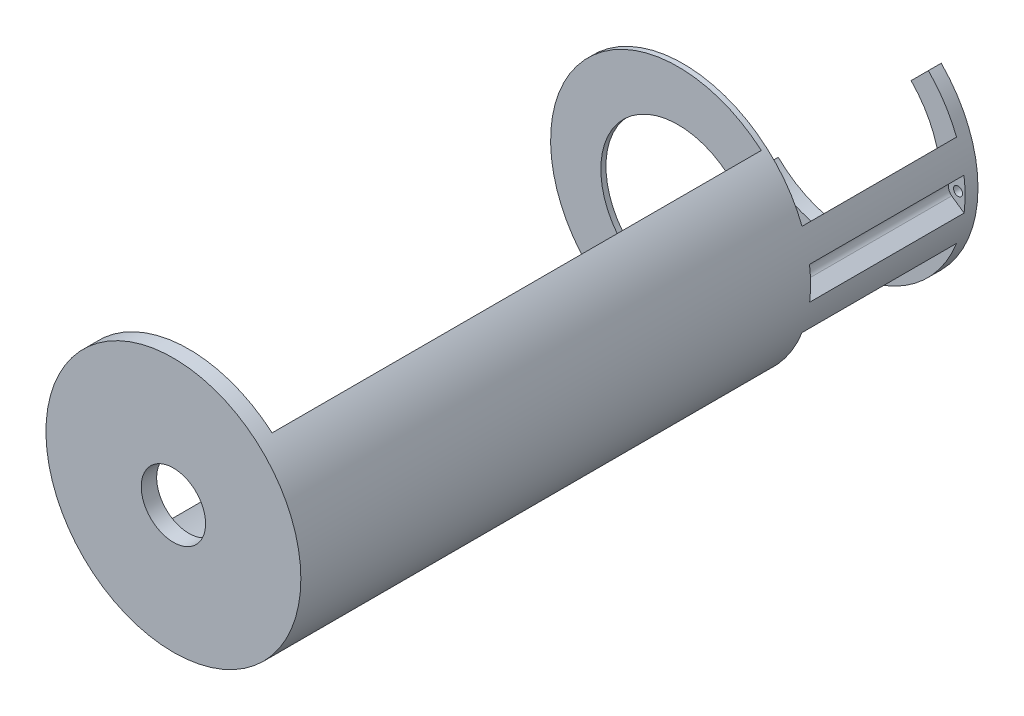
ISO-10303-21;
HEADER;
FILE_DESCRIPTION(('STEP AP214'),'2;1');
FILE_NAME('part.step','',(''),(''),'','','');
FILE_SCHEMA(('AUTOMOTIVE_DESIGN { 1 0 10303 214 1 1 1 1 }'));
ENDSEC;
DATA;
#1=APPLICATION_CONTEXT('core data for automotive mechanical design processes');
#2=APPLICATION_PROTOCOL_DEFINITION('international standard','automotive_design',2000,#1);
#3=PRODUCT_CONTEXT('',#1,'mechanical');
#4=PRODUCT('Part','Part','',(#3));
#5=PRODUCT_RELATED_PRODUCT_CATEGORY('part','',(#4));
#6=PRODUCT_DEFINITION_FORMATION('','',#4);
#7=PRODUCT_DEFINITION_CONTEXT('part definition',#1,'design');
#8=PRODUCT_DEFINITION('design','',#6,#7);
#9=PRODUCT_DEFINITION_SHAPE('','',#8);
#10=(LENGTH_UNIT() NAMED_UNIT(*) SI_UNIT(.MILLI.,.METRE.));
#11=(NAMED_UNIT(*) PLANE_ANGLE_UNIT() SI_UNIT($,.RADIAN.));
#12=(NAMED_UNIT(*) SI_UNIT($,.STERADIAN.) SOLID_ANGLE_UNIT());
#13=UNCERTAINTY_MEASURE_WITH_UNIT(LENGTH_MEASURE(1.E-05),#10,'distance_accuracy_value','');
#14=(GEOMETRIC_REPRESENTATION_CONTEXT(3) GLOBAL_UNCERTAINTY_ASSIGNED_CONTEXT((#13)) GLOBAL_UNIT_ASSIGNED_CONTEXT((#10,
#11,#12)) REPRESENTATION_CONTEXT('',''));
#15=CARTESIAN_POINT('',(0.,0.,0.));
#16=DIRECTION('',(0.,0.,1.));
#17=DIRECTION('',(1.,0.,0.));
#18=AXIS2_PLACEMENT_3D('',#15,#16,#17);
#19=CARTESIAN_POINT('',(0.,0.,0.));
#20=DIRECTION('',(0.,0.,1.));
#21=DIRECTION('',(1.,0.,0.));
#22=AXIS2_PLACEMENT_3D('',#19,#20,#21);
#23=PLANE('',#22);
#24=CARTESIAN_POINT('',(0.,-46.75,0.));
#25=DIRECTION('',(0.,0.,1.));
#26=DIRECTION('',(1.,0.,0.));
#27=AXIS2_PLACEMENT_3D('',#24,#25,#26);
#28=CIRCLE('',#27,1.75);
#29=CARTESIAN_POINT('',(1.75,-46.75,0.));
#30=VERTEX_POINT('',#29);
#31=EDGE_CURVE('E446',#30,#30,#28,.T.);
#32=ORIENTED_EDGE('',*,*,#31,.T.);
#33=EDGE_LOOP('',(#32));
#34=FACE_BOUND('',#33,.T.);
#35=CARTESIAN_POINT('',(46.75,0.,0.));
#36=DIRECTION('',(0.,0.,1.));
#37=DIRECTION('',(1.,0.,0.));
#38=AXIS2_PLACEMENT_3D('',#35,#36,#37);
#39=CIRCLE('',#38,1.75);
#40=CARTESIAN_POINT('',(48.5,0.,0.));
#41=VERTEX_POINT('',#40);
#42=EDGE_CURVE('E21',#41,#41,#39,.T.);
#43=ORIENTED_EDGE('',*,*,#42,.T.);
#44=EDGE_LOOP('',(#43));
#45=FACE_BOUND('',#44,.T.);
#46=DIRECTION('',(-0.707106781186548,-0.707106781186547,0.));
#47=VECTOR('',#46,1.);
#48=CARTESIAN_POINT('',(0.223058950909707,-0.223058950909717,0.));
#49=LINE('',#48,#47);
#50=CARTESIAN_POINT('',(35.2241338587525,34.778015956933,0.));
#51=VERTEX_POINT('',#50);
#52=CARTESIAN_POINT('',(28.5064506270227,28.0603327252033,0.));
#53=VERTEX_POINT('',#52);
#54=EDGE_CURVE('E210',#51,#53,#49,.T.);
#55=ORIENTED_EDGE('',*,*,#54,.F.);
#56=CARTESIAN_POINT('',(0.,0.,0.));
#57=DIRECTION('',(0.,0.,1.));
#58=DIRECTION('',(1.,0.,0.));
#59=AXIS2_PLACEMENT_3D('',#56,#57,#58);
#60=CIRCLE('',#59,49.5);
#61=CARTESIAN_POINT('',(-34.778015956933,-35.2241338587525,0.));
#62=VERTEX_POINT('',#61);
#63=EDGE_CURVE('E11',#62,#51,#60,.T.);
#64=ORIENTED_EDGE('',*,*,#63,.F.);
#65=CARTESIAN_POINT('',(-28.0603327252033,-28.5064506270227,0.));
#66=VERTEX_POINT('',#65);
#67=EDGE_CURVE('E202',#66,#62,#49,.T.);
#68=ORIENTED_EDGE('',*,*,#67,.F.);
#69=CARTESIAN_POINT('',(0.,0.,0.));
#70=DIRECTION('',(0.,0.,1.));
#71=DIRECTION('',(1.,0.,0.));
#72=AXIS2_PLACEMENT_3D('',#69,#70,#71);
#73=CIRCLE('',#72,40.);
#74=EDGE_CURVE('E26',#66,#53,#73,.T.);
#75=ORIENTED_EDGE('',*,*,#74,.T.);
#76=EDGE_LOOP('',(#55,#64,#68,#75));
#77=FACE_BOUND('',#76,.T.);
#78=ADVANCED_FACE('F17',(#34,#45,#77),#23,.F.);
#79=CARTESIAN_POINT('',(0.,0.,67.));
#80=DIRECTION('',(0.,0.,1.));
#81=DIRECTION('',(1.,0.,0.));
#82=AXIS2_PLACEMENT_3D('',#79,#80,#81);
#83=PLANE('',#82);
#84=CARTESIAN_POINT('',(0.,0.,67.));
#85=DIRECTION('',(0.,0.,1.));
#86=DIRECTION('',(1.,0.,0.));
#87=AXIS2_PLACEMENT_3D('',#84,#85,#86);
#88=CIRCLE('',#87,30.);
#89=CARTESIAN_POINT('',(30.,0.,67.));
#90=VERTEX_POINT('',#89);
#91=EDGE_CURVE('E304',#90,#90,#88,.T.);
#92=ORIENTED_EDGE('',*,*,#91,.F.);
#93=EDGE_LOOP('',(#92));
#94=FACE_BOUND('',#93,.T.);
#95=CARTESIAN_POINT('',(0.,0.,67.));
#96=DIRECTION('',(0.,0.,1.));
#97=DIRECTION('',(1.,0.,0.));
#98=AXIS2_PLACEMENT_3D('',#95,#96,#97);
#99=CIRCLE('',#98,41.);
#100=CARTESIAN_POINT('',(37.653229847844,16.2244963566033,67.));
#101=VERTEX_POINT('',#100);
#102=CARTESIAN_POINT('',(26.779062971522,31.046445631783,67.));
#103=VERTEX_POINT('',#102);
#104=EDGE_CURVE('E267',#101,#103,#99,.T.);
#105=ORIENTED_EDGE('',*,*,#104,.T.);
#106=DIRECTION('',(0.653147877354195,0.757230381263001,0.));
#107=VECTOR('',#106,1.);
#108=CARTESIAN_POINT('',(29.5549414502774,34.2646747521507,67.));
#109=LINE('',#108,#107);
#110=CARTESIAN_POINT('',(32.3308199290327,37.4829038725185,67.));
#111=VERTEX_POINT('',#110);
#112=EDGE_CURVE('E238',#103,#111,#109,.T.);
#113=ORIENTED_EDGE('',*,*,#112,.T.);
#114=CARTESIAN_POINT('',(0.,0.,67.));
#115=DIRECTION('',(0.,0.,1.));
#116=DIRECTION('',(1.,0.,0.));
#117=AXIS2_PLACEMENT_3D('',#114,#115,#116);
#118=CIRCLE('',#117,49.5);
#119=CARTESIAN_POINT('',(-32.3308199290327,-37.4829038725185,67.));
#120=VERTEX_POINT('',#119);
#121=EDGE_CURVE('E301',#111,#120,#118,.T.);
#122=ORIENTED_EDGE('',*,*,#121,.T.);
#123=DIRECTION('',(0.653147877354195,0.757230381263001,0.));
#124=VECTOR('',#123,1.);
#125=CARTESIAN_POINT('',(-29.5549414502774,-34.2646747521507,67.));
#126=LINE('',#125,#124);
#127=CARTESIAN_POINT('',(-26.779062971522,-31.046445631783,67.));
#128=VERTEX_POINT('',#127);
#129=EDGE_CURVE('E247',#120,#128,#126,.T.);
#130=ORIENTED_EDGE('',*,*,#129,.T.);
#131=CARTESIAN_POINT('',(0.,0.,67.));
#132=DIRECTION('',(0.,0.,1.));
#133=DIRECTION('',(1.,0.,0.));
#134=AXIS2_PLACEMENT_3D('',#131,#132,#133);
#135=CIRCLE('',#134,41.);
#136=CARTESIAN_POINT('',(-10.1526202564181,-39.7230953216006,67.));
#137=VERTEX_POINT('',#136);
#138=EDGE_CURVE('E279',#128,#137,#135,.T.);
#139=ORIENTED_EDGE('',*,*,#138,.T.);
#140=DIRECTION('',(-0.999489517793695,0.0319484556829644,0.));
#141=VECTOR('',#140,1.);
#142=CARTESIAN_POINT('',(4.91709676814576,-40.2047954074373,67.));
#143=LINE('',#142,#141);
#144=CARTESIAN_POINT('',(19.9868137927096,-40.686495493274,67.));
#145=VERTEX_POINT('',#144);
#146=EDGE_CURVE('E276',#145,#137,#143,.T.);
#147=ORIENTED_EDGE('',*,*,#146,.F.);
#148=CARTESIAN_POINT('',(-0.455831194176236,0.193095749652331,67.));
#149=DIRECTION('',(0.,0.,1.));
#150=DIRECTION('',(1.,0.,0.));
#151=AXIS2_PLACEMENT_3D('',#148,#149,#150);
#152=CIRCLE('',#151,45.7060468018028);
#153=CARTESIAN_POINT('',(42.9196917770895,-14.2154684126014,67.));
#154=VERTEX_POINT('',#153);
#155=EDGE_CURVE('E273',#145,#154,#152,.T.);
#156=ORIENTED_EDGE('',*,*,#155,.T.);
#157=DIRECTION('',(-0.170478778953512,0.985361347895542,0.));
#158=VECTOR('',#157,1.);
#159=CARTESIAN_POINT('',(40.2864608124667,1.00451397200092,67.));
#160=LINE('',#159,#158);
#161=EDGE_CURVE('E270',#154,#101,#160,.T.);
#162=ORIENTED_EDGE('',*,*,#161,.T.);
#163=EDGE_LOOP('',(#105,#113,#122,#130,#139,#147,#156,#162));
#164=FACE_BOUND('',#163,.T.);
#165=ADVANCED_FACE('F501',(#94,#164),#83,.T.);
#166=CARTESIAN_POINT('',(0.,0.,5.));
#167=DIRECTION('',(0.,0.,-1.));
#168=DIRECTION('',(-1.,0.,0.));
#169=AXIS2_PLACEMENT_3D('',#166,#167,#168);
#170=CYLINDRICAL_SURFACE('',#169,40.);
#171=DIRECTION('',(0.,0.,-1.));
#172=VECTOR('',#171,1.);
#173=CARTESIAN_POINT('',(-28.0603327252033,-28.5064506270227,5.));
#174=LINE('',#173,#172);
#175=CARTESIAN_POINT('',(-28.0603327252033,-28.5064506270227,5.));
#176=VERTEX_POINT('',#175);
#177=EDGE_CURVE('E205',#176,#66,#174,.T.);
#178=ORIENTED_EDGE('',*,*,#177,.F.);
#179=CARTESIAN_POINT('',(0.,0.,5.));
#180=DIRECTION('',(0.,0.,1.));
#181=DIRECTION('',(1.,0.,0.));
#182=AXIS2_PLACEMENT_3D('',#179,#180,#181);
#183=CIRCLE('',#182,40.);
#184=CARTESIAN_POINT('',(-10.3527618041008,-38.6370330515627,5.));
#185=VERTEX_POINT('',#184);
#186=EDGE_CURVE('E337',#176,#185,#183,.T.);
#187=ORIENTED_EDGE('',*,*,#186,.T.);
#188=DIRECTION('',(0.,0.,1.));
#189=VECTOR('',#188,1.);
#190=CARTESIAN_POINT('',(-10.3527618041008,-38.6370330515627,5.));
#191=LINE('',#190,#189);
#192=CARTESIAN_POINT('',(-10.3527618041008,-38.6370330515627,65.));
#193=VERTEX_POINT('',#192);
#194=EDGE_CURVE('E339',#185,#193,#191,.T.);
#195=ORIENTED_EDGE('',*,*,#194,.T.);
#196=CARTESIAN_POINT('',(0.,0.,65.));
#197=DIRECTION('',(0.,0.,1.));
#198=DIRECTION('',(1.,0.,0.));
#199=AXIS2_PLACEMENT_3D('',#196,#197,#198);
#200=CIRCLE('',#199,40.);
#201=CARTESIAN_POINT('',(10.3527618041008,-38.6370330515627,65.));
#202=VERTEX_POINT('',#201);
#203=EDGE_CURVE('E445',#193,#202,#200,.T.);
#204=ORIENTED_EDGE('',*,*,#203,.T.);
#205=DIRECTION('',(0.,0.,1.));
#206=VECTOR('',#205,1.);
#207=CARTESIAN_POINT('',(10.3527618041008,-38.6370330515627,5.));
#208=LINE('',#207,#206);
#209=CARTESIAN_POINT('',(10.3527618041008,-38.6370330515627,5.));
#210=VERTEX_POINT('',#209);
#211=EDGE_CURVE('E369',#210,#202,#208,.T.);
#212=ORIENTED_EDGE('',*,*,#211,.F.);
#213=CARTESIAN_POINT('',(0.,0.,5.));
#214=DIRECTION('',(0.,0.,1.));
#215=DIRECTION('',(1.,0.,0.));
#216=AXIS2_PLACEMENT_3D('',#213,#214,#215);
#217=CIRCLE('',#216,40.);
#218=CARTESIAN_POINT('',(38.6370330515627,-10.3527618041008,5.));
#219=VERTEX_POINT('',#218);
#220=EDGE_CURVE('E349',#210,#219,#217,.T.);
#221=ORIENTED_EDGE('',*,*,#220,.T.);
#222=DIRECTION('',(0.,0.,1.));
#223=VECTOR('',#222,1.);
#224=CARTESIAN_POINT('',(38.6370330515627,-10.3527618041008,5.));
#225=LINE('',#224,#223);
#226=CARTESIAN_POINT('',(38.6370330515627,-10.3527618041008,65.));
#227=VERTEX_POINT('',#226);
#228=EDGE_CURVE('E356',#219,#227,#225,.T.);
#229=ORIENTED_EDGE('',*,*,#228,.T.);
#230=CARTESIAN_POINT('',(38.6370330515627,10.3527618041008,65.));
#231=VERTEX_POINT('',#230);
#232=EDGE_CURVE('E402',#227,#231,#200,.T.);
#233=ORIENTED_EDGE('',*,*,#232,.T.);
#234=DIRECTION('',(0.,0.,1.));
#235=VECTOR('',#234,1.);
#236=CARTESIAN_POINT('',(38.6370330515627,10.3527618041008,5.));
#237=LINE('',#236,#235);
#238=CARTESIAN_POINT('',(38.6370330515627,10.3527618041008,5.));
#239=VERTEX_POINT('',#238);
#240=EDGE_CURVE('E328',#239,#231,#237,.T.);
#241=ORIENTED_EDGE('',*,*,#240,.F.);
#242=CARTESIAN_POINT('',(0.,0.,5.));
#243=DIRECTION('',(0.,0.,1.));
#244=DIRECTION('',(1.,0.,0.));
#245=AXIS2_PLACEMENT_3D('',#242,#243,#244);
#246=CIRCLE('',#245,40.);
#247=CARTESIAN_POINT('',(28.5064506270227,28.0603327252033,5.));
#248=VERTEX_POINT('',#247);
#249=EDGE_CURVE('E318',#239,#248,#246,.T.);
#250=ORIENTED_EDGE('',*,*,#249,.T.);
#251=DIRECTION('',(0.,0.,-1.));
#252=VECTOR('',#251,1.);
#253=CARTESIAN_POINT('',(28.5064506270227,28.0603327252033,5.));
#254=LINE('',#253,#252);
#255=EDGE_CURVE('E34',#53,#248,#254,.F.);
#256=ORIENTED_EDGE('',*,*,#255,.F.);
#257=ORIENTED_EDGE('',*,*,#74,.F.);
#258=EDGE_LOOP('',(#178,#187,#195,#204,#212,#221,#229,#233,#241,#250,#256,#257));
#259=FACE_BOUND('',#258,.T.);
#260=ADVANCED_FACE('F19',(#259),#170,.F.);
#261=CARTESIAN_POINT('',(0.,-46.75,-7.5));
#262=DIRECTION('',(0.,0.,1.));
#263=DIRECTION('',(1.,0.,0.));
#264=AXIS2_PLACEMENT_3D('',#261,#262,#263);
#265=CYLINDRICAL_SURFACE('',#264,1.75);
#266=ORIENTED_EDGE('',*,*,#31,.F.);
#267=EDGE_LOOP('',(#266));
#268=FACE_BOUND('',#267,.T.);
#269=CARTESIAN_POINT('',(0.,-46.75,5.));
#270=DIRECTION('',(0.,0.,1.));
#271=DIRECTION('',(1.,0.,0.));
#272=AXIS2_PLACEMENT_3D('',#269,#270,#271);
#273=CIRCLE('',#272,1.75);
#274=CARTESIAN_POINT('',(1.75,-46.75,5.));
#275=VERTEX_POINT('',#274);
#276=EDGE_CURVE('E422',#275,#275,#273,.T.);
#277=ORIENTED_EDGE('',*,*,#276,.T.);
#278=EDGE_LOOP('',(#277));
#279=FACE_BOUND('',#278,.T.);
#280=ADVANCED_FACE('F510',(#268,#279),#265,.F.);
#281=CARTESIAN_POINT('',(46.75,0.,-7.5));
#282=DIRECTION('',(0.,0.,1.));
#283=DIRECTION('',(1.,0.,0.));
#284=AXIS2_PLACEMENT_3D('',#281,#282,#283);
#285=CYLINDRICAL_SURFACE('',#284,1.75);
#286=ORIENTED_EDGE('',*,*,#42,.F.);
#287=EDGE_LOOP('',(#286));
#288=FACE_BOUND('',#287,.T.);
#289=CARTESIAN_POINT('',(46.75,0.,5.));
#290=DIRECTION('',(0.,0.,1.));
#291=DIRECTION('',(1.,0.,0.));
#292=AXIS2_PLACEMENT_3D('',#289,#290,#291);
#293=CIRCLE('',#292,1.75);
#294=CARTESIAN_POINT('',(48.5,0.,5.));
#295=VERTEX_POINT('',#294);
#296=EDGE_CURVE('E386',#295,#295,#293,.T.);
#297=ORIENTED_EDGE('',*,*,#296,.T.);
#298=EDGE_LOOP('',(#297));
#299=FACE_BOUND('',#298,.T.);
#300=ADVANCED_FACE('F514',(#288,#299),#285,.F.);
#301=CARTESIAN_POINT('',(0.,0.,5.));
#302=DIRECTION('',(0.,0.,-1.));
#303=DIRECTION('',(-1.,0.,0.));
#304=AXIS2_PLACEMENT_3D('',#301,#302,#303);
#305=CYLINDRICAL_SURFACE('',#304,49.5);
#306=DIRECTION('',(0.,0.,1.));
#307=VECTOR('',#306,1.);
#308=CARTESIAN_POINT('',(-6.17979783780856,-49.1127284793241,5.));
#309=LINE('',#308,#307);
#310=CARTESIAN_POINT('',(-6.17979783780856,-49.1127284793241,5.));
#311=VERTEX_POINT('',#310);
#312=CARTESIAN_POINT('',(-6.17979783780856,-49.1127284793241,65.));
#313=VERTEX_POINT('',#312);
#314=EDGE_CURVE('E395',#311,#313,#309,.T.);
#315=ORIENTED_EDGE('',*,*,#314,.T.);
#316=CARTESIAN_POINT('',(0.,0.,65.));
#317=DIRECTION('',(0.,0.,1.));
#318=DIRECTION('',(1.,0.,0.));
#319=AXIS2_PLACEMENT_3D('',#316,#317,#318);
#320=CIRCLE('',#319,49.5);
#321=CARTESIAN_POINT('',(6.52667389542323,-49.0678359810457,65.));
#322=VERTEX_POINT('',#321);
#323=EDGE_CURVE('E465',#313,#322,#320,.T.);
#324=ORIENTED_EDGE('',*,*,#323,.T.);
#325=DIRECTION('',(0.,0.,1.));
#326=VECTOR('',#325,1.);
#327=CARTESIAN_POINT('',(6.52667389542323,-49.0678359810457,5.));
#328=LINE('',#327,#326);
#329=CARTESIAN_POINT('',(6.52667389542323,-49.0678359810457,5.));
#330=VERTEX_POINT('',#329);
#331=EDGE_CURVE('E435',#330,#322,#328,.T.);
#332=ORIENTED_EDGE('',*,*,#331,.F.);
#333=CARTESIAN_POINT('',(0.,0.,5.));
#334=DIRECTION('',(0.,0.,1.));
#335=DIRECTION('',(1.,0.,0.));
#336=AXIS2_PLACEMENT_3D('',#333,#334,#335);
#337=CIRCLE('',#336,49.5);
#338=EDGE_CURVE('E418',#311,#330,#337,.T.);
#339=ORIENTED_EDGE('',*,*,#338,.F.);
#340=EDGE_LOOP('',(#315,#324,#332,#339));
#341=FACE_BOUND('',#340,.T.);
#342=DIRECTION('',(0.,0.,1.));
#343=VECTOR('',#342,1.);
#344=CARTESIAN_POINT('',(17.8754376759431,-46.159708923405,5.));
#345=LINE('',#344,#343);
#346=CARTESIAN_POINT('',(17.8754376759431,-46.159708923405,5.));
#347=VERTEX_POINT('',#346);
#348=CARTESIAN_POINT('',(17.8754376759431,-46.159708923405,65.));
#349=VERTEX_POINT('',#348);
#350=EDGE_CURVE('E366',#347,#349,#345,.T.);
#351=ORIENTED_EDGE('',*,*,#350,.T.);
#352=CARTESIAN_POINT('',(46.159708923405,-17.8754376759431,65.));
#353=VERTEX_POINT('',#352);
#354=EDGE_CURVE('E311',#349,#353,#320,.T.);
#355=ORIENTED_EDGE('',*,*,#354,.T.);
#356=DIRECTION('',(0.,0.,1.));
#357=VECTOR('',#356,1.);
#358=CARTESIAN_POINT('',(46.159708923405,-17.8754376759431,5.));
#359=LINE('',#358,#357);
#360=CARTESIAN_POINT('',(46.159708923405,-17.8754376759431,5.));
#361=VERTEX_POINT('',#360);
#362=EDGE_CURVE('E363',#361,#353,#359,.T.);
#363=ORIENTED_EDGE('',*,*,#362,.F.);
#364=CARTESIAN_POINT('',(0.,0.,5.));
#365=DIRECTION('',(0.,0.,1.));
#366=DIRECTION('',(1.,0.,0.));
#367=AXIS2_PLACEMENT_3D('',#364,#365,#366);
#368=CIRCLE('',#367,49.5);
#369=EDGE_CURVE('E354',#347,#361,#368,.T.);
#370=ORIENTED_EDGE('',*,*,#369,.F.);
#371=EDGE_LOOP('',(#351,#355,#363,#370));
#372=FACE_BOUND('',#371,.T.);
#373=CARTESIAN_POINT('',(0.,0.,5.));
#374=DIRECTION('',(0.,0.,1.));
#375=DIRECTION('',(1.,0.,0.));
#376=AXIS2_PLACEMENT_3D('',#373,#374,#375);
#377=CIRCLE('',#376,49.5);
#378=CARTESIAN_POINT('',(-34.778015956933,-35.2241338587525,5.));
#379=VERTEX_POINT('',#378);
#380=CARTESIAN_POINT('',(-17.8754376759431,-46.159708923405,5.));
#381=VERTEX_POINT('',#380);
#382=EDGE_CURVE('E218',#379,#381,#377,.T.);
#383=ORIENTED_EDGE('',*,*,#382,.F.);
#384=DIRECTION('',(0.,0.,-1.));
#385=VECTOR('',#384,1.);
#386=CARTESIAN_POINT('',(-34.778015956933,-35.2241338587525,65.));
#387=LINE('',#386,#385);
#388=EDGE_CURVE('E42',#379,#62,#387,.T.);
#389=ORIENTED_EDGE('',*,*,#388,.T.);
#390=ORIENTED_EDGE('',*,*,#63,.T.);
#391=DIRECTION('',(0.,0.,-1.));
#392=VECTOR('',#391,1.);
#393=CARTESIAN_POINT('',(35.2241338587525,34.778015956933,65.));
#394=LINE('',#393,#392);
#395=CARTESIAN_POINT('',(35.2241338587525,34.778015956933,5.));
#396=VERTEX_POINT('',#395);
#397=EDGE_CURVE('E219',#396,#51,#394,.T.);
#398=ORIENTED_EDGE('',*,*,#397,.F.);
#399=CARTESIAN_POINT('',(0.,0.,5.));
#400=DIRECTION('',(0.,0.,1.));
#401=DIRECTION('',(1.,0.,0.));
#402=AXIS2_PLACEMENT_3D('',#399,#400,#401);
#403=CIRCLE('',#402,49.5);
#404=CARTESIAN_POINT('',(46.159708923405,17.8754376759431,5.));
#405=VERTEX_POINT('',#404);
#406=EDGE_CURVE('E319',#405,#396,#403,.T.);
#407=ORIENTED_EDGE('',*,*,#406,.F.);
#408=DIRECTION('',(0.,0.,1.));
#409=VECTOR('',#408,1.);
#410=CARTESIAN_POINT('',(46.159708923405,17.8754376759431,5.));
#411=LINE('',#410,#409);
#412=CARTESIAN_POINT('',(46.159708923405,17.8754376759431,65.));
#413=VERTEX_POINT('',#412);
#414=EDGE_CURVE('E325',#405,#413,#411,.T.);
#415=ORIENTED_EDGE('',*,*,#414,.T.);
#416=CARTESIAN_POINT('',(-17.8754376759431,-46.159708923405,65.));
#417=VERTEX_POINT('',#416);
#418=EDGE_CURVE('E312',#413,#417,#320,.T.);
#419=ORIENTED_EDGE('',*,*,#418,.T.);
#420=DIRECTION('',(0.,0.,1.));
#421=VECTOR('',#420,1.);
#422=CARTESIAN_POINT('',(-17.8754376759431,-46.159708923405,5.));
#423=LINE('',#422,#421);
#424=EDGE_CURVE('E327',#381,#417,#423,.T.);
#425=ORIENTED_EDGE('',*,*,#424,.F.);
#426=EDGE_LOOP('',(#383,#389,#390,#398,#407,#415,#419,#425));
#427=FACE_BOUND('',#426,.T.);
#428=DIRECTION('',(0.,0.,1.));
#429=VECTOR('',#428,1.);
#430=CARTESIAN_POINT('',(49.1127284793241,-6.17979783780856,5.));
#431=LINE('',#430,#429);
#432=CARTESIAN_POINT('',(49.1127284793241,-6.17979783780856,5.));
#433=VERTEX_POINT('',#432);
#434=CARTESIAN_POINT('',(49.1127284793241,-6.17979783780856,65.));
#435=VERTEX_POINT('',#434);
#436=EDGE_CURVE('E399',#433,#435,#431,.T.);
#437=ORIENTED_EDGE('',*,*,#436,.T.);
#438=CARTESIAN_POINT('',(49.0678359810457,6.52667389542322,65.));
#439=VERTEX_POINT('',#438);
#440=EDGE_CURVE('E300',#435,#439,#320,.T.);
#441=ORIENTED_EDGE('',*,*,#440,.T.);
#442=DIRECTION('',(0.,0.,1.));
#443=VECTOR('',#442,1.);
#444=CARTESIAN_POINT('',(49.0678359810457,6.52667389542322,5.));
#445=LINE('',#444,#443);
#446=CARTESIAN_POINT('',(49.0678359810457,6.52667389542322,5.));
#447=VERTEX_POINT('',#446);
#448=EDGE_CURVE('E403',#447,#439,#445,.T.);
#449=ORIENTED_EDGE('',*,*,#448,.F.);
#450=CARTESIAN_POINT('',(0.,0.,5.));
#451=DIRECTION('',(0.,0.,1.));
#452=DIRECTION('',(1.,0.,0.));
#453=AXIS2_PLACEMENT_3D('',#450,#451,#452);
#454=CIRCLE('',#453,49.5);
#455=EDGE_CURVE('E382',#433,#447,#454,.T.);
#456=ORIENTED_EDGE('',*,*,#455,.F.);
#457=EDGE_LOOP('',(#437,#441,#449,#456));
#458=FACE_BOUND('',#457,.T.);
#459=ORIENTED_EDGE('',*,*,#121,.F.);
#460=DIRECTION('',(0.,0.,-1.));
#461=VECTOR('',#460,1.);
#462=CARTESIAN_POINT('',(32.3308199290327,37.4829038725185,257.));
#463=LINE('',#462,#461);
#464=CARTESIAN_POINT('',(32.3308199290327,37.4829038725185,257.));
#465=VERTEX_POINT('',#464);
#466=EDGE_CURVE('E264',#465,#111,#463,.T.);
#467=ORIENTED_EDGE('',*,*,#466,.F.);
#468=CARTESIAN_POINT('',(0.,0.,257.));
#469=DIRECTION('',(0.,0.,1.));
#470=DIRECTION('',(1.,0.,0.));
#471=AXIS2_PLACEMENT_3D('',#468,#469,#470);
#472=CIRCLE('',#471,49.5);
#473=CARTESIAN_POINT('',(-32.3308199290327,-37.4829038725185,257.));
#474=VERTEX_POINT('',#473);
#475=EDGE_CURVE('E230',#465,#474,#472,.T.);
#476=ORIENTED_EDGE('',*,*,#475,.T.);
#477=DIRECTION('',(0.,0.,-1.));
#478=VECTOR('',#477,1.);
#479=CARTESIAN_POINT('',(-32.3308199290327,-37.4829038725185,257.));
#480=LINE('',#479,#478);
#481=EDGE_CURVE('E285',#474,#120,#480,.T.);
#482=ORIENTED_EDGE('',*,*,#481,.T.);
#483=EDGE_LOOP('',(#459,#467,#476,#482));
#484=FACE_BOUND('',#483,.T.);
#485=CARTESIAN_POINT('',(0.,0.,263.));
#486=DIRECTION('',(0.,0.,1.));
#487=DIRECTION('',(1.,0.,0.));
#488=AXIS2_PLACEMENT_3D('',#485,#486,#487);
#489=CIRCLE('',#488,49.5);
#490=CARTESIAN_POINT('',(49.5,0.,263.));
#491=VERTEX_POINT('',#490);
#492=EDGE_CURVE('E231',#491,#491,#489,.T.);
#493=ORIENTED_EDGE('',*,*,#492,.F.);
#494=EDGE_LOOP('',(#493));
#495=FACE_BOUND('',#494,.T.);
#496=ADVANCED_FACE('F214',(#341,#372,#427,#458,#484,#495),#305,.T.);
#497=CARTESIAN_POINT('',(-3.09406770596711,-44.6233316798144,5.));
#498=DIRECTION('',(-0.824104492363064,0.566437803882312,0.));
#499=DIRECTION('',(-0.566437803882312,-0.824104492363064,0.));
#500=AXIS2_PLACEMENT_3D('',#497,#498,#499);
#501=PLANE('',#500);
#502=DIRECTION('',(-0.566437803882312,-0.824104492363064,0.));
#503=VECTOR('',#502,1.);
#504=CARTESIAN_POINT('',(-3.09406770596711,-44.6233316798144,65.));
#505=LINE('',#504,#503);
#506=CARTESIAN_POINT('',(-2.85337303923722,-44.2731475028748,65.));
#507=VERTEX_POINT('',#506);
#508=EDGE_CURVE('E415',#507,#313,#505,.T.);
#509=ORIENTED_EDGE('',*,*,#508,.T.);
#510=ORIENTED_EDGE('',*,*,#314,.F.);
#511=DIRECTION('',(-0.566437803882312,-0.824104492363064,0.));
#512=VECTOR('',#511,1.);
#513=CARTESIAN_POINT('',(-3.09406770596711,-44.6233316798144,5.));
#514=LINE('',#513,#512);
#515=CARTESIAN_POINT('',(-2.85337303923722,-44.2731475028748,5.));
#516=VERTEX_POINT('',#515);
#517=EDGE_CURVE('E419',#516,#311,#514,.T.);
#518=ORIENTED_EDGE('',*,*,#517,.F.);
#519=DIRECTION('',(0.,0.,1.));
#520=VECTOR('',#519,1.);
#521=CARTESIAN_POINT('',(-2.85337303923722,-44.2731475028748,5.));
#522=LINE('',#521,#520);
#523=EDGE_CURVE('E425',#516,#507,#522,.T.);
#524=ORIENTED_EDGE('',*,*,#523,.T.);
#525=EDGE_LOOP('',(#509,#510,#518,#524));
#526=FACE_BOUND('',#525,.T.);
#527=ADVANCED_FACE('F513',(#526),#501,.F.);
#528=CARTESIAN_POINT('',(7.20603961492221,-49.9545988995419,5.));
#529=DIRECTION('',(-0.793816320536165,-0.60815758586934,0.));
#530=DIRECTION('',(0.60815758586934,-0.793816320536166,0.));
#531=AXIS2_PLACEMENT_3D('',#528,#529,#530);
#532=PLANE('',#531);
#533=DIRECTION('',(0.60815758586934,-0.793816320536166,0.));
#534=VECTOR('',#533,1.);
#535=CARTESIAN_POINT('',(7.20603961492221,-49.9545988995419,65.));
#536=LINE('',#535,#534);
#537=CARTESIAN_POINT('',(2.85337303923721,-44.2731475028748,65.));
#538=VERTEX_POINT('',#537);
#539=EDGE_CURVE('E429',#538,#322,#536,.T.);
#540=ORIENTED_EDGE('',*,*,#539,.F.);
#541=DIRECTION('',(0.,0.,1.));
#542=VECTOR('',#541,1.);
#543=CARTESIAN_POINT('',(2.85337303923722,-44.2731475028748,5.));
#544=LINE('',#543,#542);
#545=CARTESIAN_POINT('',(2.85337303923722,-44.2731475028748,5.));
#546=VERTEX_POINT('',#545);
#547=EDGE_CURVE('E438',#546,#538,#544,.T.);
#548=ORIENTED_EDGE('',*,*,#547,.F.);
#549=DIRECTION('',(0.60815758586934,-0.793816320536166,0.));
#550=VECTOR('',#549,1.);
#551=CARTESIAN_POINT('',(7.20603961492221,-49.9545988995419,5.));
#552=LINE('',#551,#550);
#553=EDGE_CURVE('E414',#546,#330,#552,.T.);
#554=ORIENTED_EDGE('',*,*,#553,.T.);
#555=ORIENTED_EDGE('',*,*,#331,.T.);
#556=EDGE_LOOP('',(#540,#548,#554,#555));
#557=FACE_BOUND('',#556,.T.);
#558=ADVANCED_FACE('F519',(#557),#532,.T.);
#559=CARTESIAN_POINT('',(0.,-46.75,5.));
#560=DIRECTION('',(0.,0.,1.));
#561=DIRECTION('',(1.,0.,0.));
#562=AXIS2_PLACEMENT_3D('',#559,#560,#561);
#563=CYLINDRICAL_SURFACE('',#562,3.77843036108395);
#564=CARTESIAN_POINT('',(0.,-46.75,65.));
#565=DIRECTION('',(0.,0.,1.));
#566=DIRECTION('',(1.,0.,0.));
#567=AXIS2_PLACEMENT_3D('',#564,#565,#566);
#568=CIRCLE('',#567,3.77843036108395);
#569=EDGE_CURVE('E372',#538,#507,#568,.T.);
#570=ORIENTED_EDGE('',*,*,#569,.T.);
#571=ORIENTED_EDGE('',*,*,#523,.F.);
#572=CARTESIAN_POINT('',(0.,-46.75,5.));
#573=DIRECTION('',(0.,0.,1.));
#574=DIRECTION('',(1.,0.,0.));
#575=AXIS2_PLACEMENT_3D('',#572,#573,#574);
#576=CIRCLE('',#575,3.77843036108395);
#577=EDGE_CURVE('E411',#546,#516,#576,.T.);
#578=ORIENTED_EDGE('',*,*,#577,.F.);
#579=ORIENTED_EDGE('',*,*,#547,.T.);
#580=EDGE_LOOP('',(#570,#571,#578,#579));
#581=FACE_BOUND('',#580,.T.);
#582=ADVANCED_FACE('F530',(#581),#563,.F.);
#583=CARTESIAN_POINT('',(0.,0.,5.));
#584=DIRECTION('',(0.,0.,1.));
#585=DIRECTION('',(1.,0.,0.));
#586=AXIS2_PLACEMENT_3D('',#583,#584,#585);
#587=PLANE('',#586);
#588=ORIENTED_EDGE('',*,*,#276,.F.);
#589=EDGE_LOOP('',(#588));
#590=FACE_BOUND('',#589,.T.);
#591=ORIENTED_EDGE('',*,*,#517,.T.);
#592=ORIENTED_EDGE('',*,*,#338,.T.);
#593=ORIENTED_EDGE('',*,*,#553,.F.);
#594=ORIENTED_EDGE('',*,*,#577,.T.);
#595=EDGE_LOOP('',(#591,#592,#593,#594));
#596=FACE_BOUND('',#595,.T.);
#597=ADVANCED_FACE('F526',(#590,#596),#587,.T.);
#598=CARTESIAN_POINT('',(44.6233316798144,-3.09406770596712,5.));
#599=DIRECTION('',(-0.566437803882312,-0.824104492363064,0.));
#600=DIRECTION('',(0.824104492363064,-0.566437803882312,0.));
#601=AXIS2_PLACEMENT_3D('',#598,#599,#600);
#602=PLANE('',#601);
#603=DIRECTION('',(0.824104492363064,-0.566437803882312,0.));
#604=VECTOR('',#603,1.);
#605=CARTESIAN_POINT('',(44.6233316798144,-3.09406770596712,65.));
#606=LINE('',#605,#604);
#607=CARTESIAN_POINT('',(44.2731475028748,-2.85337303923722,65.));
#608=VERTEX_POINT('',#607);
#609=EDGE_CURVE('E379',#608,#435,#606,.T.);
#610=ORIENTED_EDGE('',*,*,#609,.T.);
#611=ORIENTED_EDGE('',*,*,#436,.F.);
#612=DIRECTION('',(0.824104492363064,-0.566437803882312,0.));
#613=VECTOR('',#612,1.);
#614=CARTESIAN_POINT('',(44.6233316798144,-3.09406770596712,5.));
#615=LINE('',#614,#613);
#616=CARTESIAN_POINT('',(44.2731475028748,-2.85337303923722,5.));
#617=VERTEX_POINT('',#616);
#618=EDGE_CURVE('E383',#617,#433,#615,.T.);
#619=ORIENTED_EDGE('',*,*,#618,.F.);
#620=DIRECTION('',(0.,0.,1.));
#621=VECTOR('',#620,1.);
#622=CARTESIAN_POINT('',(44.2731475028748,-2.85337303923722,5.));
#623=LINE('',#622,#621);
#624=EDGE_CURVE('E389',#617,#608,#623,.T.);
#625=ORIENTED_EDGE('',*,*,#624,.T.);
#626=EDGE_LOOP('',(#610,#611,#619,#625));
#627=FACE_BOUND('',#626,.T.);
#628=ADVANCED_FACE('F543',(#627),#602,.F.);
#629=CARTESIAN_POINT('',(49.9545988995419,7.20603961492221,5.));
#630=DIRECTION('',(0.60815758586934,-0.793816320536165,0.));
#631=DIRECTION('',(0.793816320536166,0.60815758586934,0.));
#632=AXIS2_PLACEMENT_3D('',#629,#630,#631);
#633=PLANE('',#632);
#634=DIRECTION('',(0.793816320536166,0.60815758586934,0.));
#635=VECTOR('',#634,1.);
#636=CARTESIAN_POINT('',(49.9545988995419,7.20603961492221,65.));
#637=LINE('',#636,#635);
#638=CARTESIAN_POINT('',(44.2731475028748,2.85337303923721,65.));
#639=VERTEX_POINT('',#638);
#640=EDGE_CURVE('E394',#639,#439,#637,.T.);
#641=ORIENTED_EDGE('',*,*,#640,.F.);
#642=DIRECTION('',(0.,0.,1.));
#643=VECTOR('',#642,1.);
#644=CARTESIAN_POINT('',(44.2731475028748,2.85337303923721,5.));
#645=LINE('',#644,#643);
#646=CARTESIAN_POINT('',(44.2731475028748,2.85337303923721,5.));
#647=VERTEX_POINT('',#646);
#648=EDGE_CURVE('E406',#647,#639,#645,.T.);
#649=ORIENTED_EDGE('',*,*,#648,.F.);
#650=DIRECTION('',(0.793816320536166,0.60815758586934,0.));
#651=VECTOR('',#650,1.);
#652=CARTESIAN_POINT('',(49.9545988995419,7.20603961492221,5.));
#653=LINE('',#652,#651);
#654=EDGE_CURVE('E378',#647,#447,#653,.T.);
#655=ORIENTED_EDGE('',*,*,#654,.T.);
#656=ORIENTED_EDGE('',*,*,#448,.T.);
#657=EDGE_LOOP('',(#641,#649,#655,#656));
#658=FACE_BOUND('',#657,.T.);
#659=ADVANCED_FACE('F549',(#658),#633,.T.);
#660=CARTESIAN_POINT('',(46.75,0.,5.));
#661=DIRECTION('',(0.,0.,1.));
#662=DIRECTION('',(1.,0.,0.));
#663=AXIS2_PLACEMENT_3D('',#660,#661,#662);
#664=CYLINDRICAL_SURFACE('',#663,3.77843036108395);
#665=CARTESIAN_POINT('',(46.75,0.,65.));
#666=DIRECTION('',(0.,0.,1.));
#667=DIRECTION('',(1.,0.,0.));
#668=AXIS2_PLACEMENT_3D('',#665,#666,#667);
#669=CIRCLE('',#668,3.77843036108395);
#670=EDGE_CURVE('E391',#639,#608,#669,.T.);
#671=ORIENTED_EDGE('',*,*,#670,.T.);
#672=ORIENTED_EDGE('',*,*,#624,.F.);
#673=CARTESIAN_POINT('',(46.75,0.,5.));
#674=DIRECTION('',(0.,0.,1.));
#675=DIRECTION('',(1.,0.,0.));
#676=AXIS2_PLACEMENT_3D('',#673,#674,#675);
#677=CIRCLE('',#676,3.77843036108395);
#678=EDGE_CURVE('E375',#647,#617,#677,.T.);
#679=ORIENTED_EDGE('',*,*,#678,.F.);
#680=ORIENTED_EDGE('',*,*,#648,.T.);
#681=EDGE_LOOP('',(#671,#672,#679,#680));
#682=FACE_BOUND('',#681,.T.);
#683=ADVANCED_FACE('F545',(#682),#664,.F.);
#684=CARTESIAN_POINT('',(0.,0.,5.));
#685=DIRECTION('',(0.,0.,1.));
#686=DIRECTION('',(1.,0.,0.));
#687=AXIS2_PLACEMENT_3D('',#684,#685,#686);
#688=PLANE('',#687);
#689=ORIENTED_EDGE('',*,*,#296,.F.);
#690=EDGE_LOOP('',(#689));
#691=FACE_BOUND('',#690,.T.);
#692=ORIENTED_EDGE('',*,*,#618,.T.);
#693=ORIENTED_EDGE('',*,*,#455,.T.);
#694=ORIENTED_EDGE('',*,*,#654,.F.);
#695=ORIENTED_EDGE('',*,*,#678,.T.);
#696=EDGE_LOOP('',(#692,#693,#694,#695));
#697=FACE_BOUND('',#696,.T.);
#698=ADVANCED_FACE('F548',(#691,#697),#688,.T.);
#699=CARTESIAN_POINT('',(15.6107896473817,-43.8950608948436,5.));
#700=DIRECTION('',(-0.707106781186547,-0.707106781186548,0.));
#701=DIRECTION('',(0.707106781186548,-0.707106781186548,0.));
#702=AXIS2_PLACEMENT_3D('',#699,#700,#701);
#703=PLANE('',#702);
#704=DIRECTION('',(0.707106781186548,-0.707106781186548,0.));
#705=VECTOR('',#704,1.);
#706=CARTESIAN_POINT('',(15.6107896473817,-43.8950608948436,65.));
#707=LINE('',#706,#705);
#708=EDGE_CURVE('E331',#202,#349,#707,.T.);
#709=ORIENTED_EDGE('',*,*,#708,.T.);
#710=ORIENTED_EDGE('',*,*,#350,.F.);
#711=DIRECTION('',(0.707106781186548,-0.707106781186548,0.));
#712=VECTOR('',#711,1.);
#713=CARTESIAN_POINT('',(15.6107896473817,-43.8950608948436,5.));
#714=LINE('',#713,#712);
#715=EDGE_CURVE('E347',#210,#347,#714,.T.);
#716=ORIENTED_EDGE('',*,*,#715,.F.);
#717=ORIENTED_EDGE('',*,*,#211,.T.);
#718=EDGE_LOOP('',(#709,#710,#716,#717));
#719=FACE_BOUND('',#718,.T.);
#720=ADVANCED_FACE('F559',(#719),#703,.F.);
#721=CARTESIAN_POINT('',(47.1381971145239,-18.853925867062,5.));
#722=DIRECTION('',(0.707106781186547,0.707106781186548,0.));
#723=DIRECTION('',(-0.707106781186548,0.707106781186548,0.));
#724=AXIS2_PLACEMENT_3D('',#721,#722,#723);
#725=PLANE('',#724);
#726=DIRECTION('',(-0.707106781186548,0.707106781186548,0.));
#727=VECTOR('',#726,1.);
#728=CARTESIAN_POINT('',(47.1381971145239,-18.853925867062,65.));
#729=LINE('',#728,#727);
#730=EDGE_CURVE('E350',#353,#227,#729,.T.);
#731=ORIENTED_EDGE('',*,*,#730,.T.);
#732=ORIENTED_EDGE('',*,*,#228,.F.);
#733=DIRECTION('',(-0.707106781186548,0.707106781186548,0.));
#734=VECTOR('',#733,1.);
#735=CARTESIAN_POINT('',(47.1381971145239,-18.853925867062,5.));
#736=LINE('',#735,#734);
#737=EDGE_CURVE('E351',#361,#219,#736,.T.);
#738=ORIENTED_EDGE('',*,*,#737,.F.);
#739=ORIENTED_EDGE('',*,*,#362,.T.);
#740=EDGE_LOOP('',(#731,#732,#738,#739));
#741=FACE_BOUND('',#740,.T.);
#742=ADVANCED_FACE('F476',(#741),#725,.F.);
#743=CARTESIAN_POINT('',(0.557686546132849,1.96632985484384,5.));
#744=DIRECTION('',(0.,0.,1.));
#745=DIRECTION('',(1.,0.,0.));
#746=AXIS2_PLACEMENT_3D('',#743,#744,#745);
#747=PLANE('',#746);
#748=ORIENTED_EDGE('',*,*,#220,.F.);
#749=ORIENTED_EDGE('',*,*,#715,.T.);
#750=ORIENTED_EDGE('',*,*,#369,.T.);
#751=ORIENTED_EDGE('',*,*,#737,.T.);
#752=EDGE_LOOP('',(#748,#749,#750,#751));
#753=FACE_BOUND('',#752,.T.);
#754=ADVANCED_FACE('F479',(#753),#747,.T.);
#755=CARTESIAN_POINT('',(48.3235334963075,20.0392622488456,5.));
#756=DIRECTION('',(-0.707106781186548,0.707106781186547,0.));
#757=DIRECTION('',(-0.707106781186547,-0.707106781186548,0.));
#758=AXIS2_PLACEMENT_3D('',#755,#756,#757);
#759=PLANE('',#758);
#760=DIRECTION('',(-0.707106781186547,-0.707106781186548,0.));
#761=VECTOR('',#760,1.);
#762=CARTESIAN_POINT('',(48.3235334963075,20.0392622488456,65.));
#763=LINE('',#762,#761);
#764=EDGE_CURVE('E322',#413,#231,#763,.T.);
#765=ORIENTED_EDGE('',*,*,#764,.F.);
#766=ORIENTED_EDGE('',*,*,#414,.F.);
#767=DIRECTION('',(-0.707106781186547,-0.707106781186548,0.));
#768=VECTOR('',#767,1.);
#769=CARTESIAN_POINT('',(48.3235334963075,20.0392622488456,5.));
#770=LINE('',#769,#768);
#771=EDGE_CURVE('E315',#405,#239,#770,.T.);
#772=ORIENTED_EDGE('',*,*,#771,.T.);
#773=ORIENTED_EDGE('',*,*,#240,.T.);
#774=EDGE_LOOP('',(#765,#766,#772,#773));
#775=FACE_BOUND('',#774,.T.);
#776=ADVANCED_FACE('F482',(#775),#759,.T.);
#777=CARTESIAN_POINT('',(0.557686546132849,1.96632985484384,5.));
#778=DIRECTION('',(0.,0.,1.));
#779=DIRECTION('',(1.,0.,0.));
#780=AXIS2_PLACEMENT_3D('',#777,#778,#779);
#781=PLANE('',#780);
#782=DIRECTION('',(0.707106781186548,0.707106781186547,0.));
#783=VECTOR('',#782,1.);
#784=CARTESIAN_POINT('',(1.48506715139805,1.03894924957863,5.));
#785=LINE('',#784,#783);
#786=EDGE_CURVE('E227',#248,#396,#785,.T.);
#787=ORIENTED_EDGE('',*,*,#786,.F.);
#788=ORIENTED_EDGE('',*,*,#249,.F.);
#789=ORIENTED_EDGE('',*,*,#771,.F.);
#790=ORIENTED_EDGE('',*,*,#406,.T.);
#791=EDGE_LOOP('',(#787,#788,#789,#790));
#792=FACE_BOUND('',#791,.T.);
#793=ADVANCED_FACE('F484',(#792),#781,.T.);
#794=CARTESIAN_POINT('',(-16.933108744295,-45.217379991757,5.));
#795=DIRECTION('',(-0.707106781186548,0.707106781186547,0.));
#796=DIRECTION('',(-0.707106781186547,-0.707106781186548,0.));
#797=AXIS2_PLACEMENT_3D('',#794,#795,#796);
#798=PLANE('',#797);
#799=DIRECTION('',(-0.707106781186547,-0.707106781186548,0.));
#800=VECTOR('',#799,1.);
#801=CARTESIAN_POINT('',(-16.933108744295,-45.217379991757,65.));
#802=LINE('',#801,#800);
#803=EDGE_CURVE('E308',#193,#417,#802,.T.);
#804=ORIENTED_EDGE('',*,*,#803,.F.);
#805=ORIENTED_EDGE('',*,*,#194,.F.);
#806=DIRECTION('',(-0.707106781186547,-0.707106781186548,0.));
#807=VECTOR('',#806,1.);
#808=CARTESIAN_POINT('',(-16.933108744295,-45.217379991757,5.));
#809=LINE('',#808,#807);
#810=EDGE_CURVE('E334',#185,#381,#809,.T.);
#811=ORIENTED_EDGE('',*,*,#810,.T.);
#812=ORIENTED_EDGE('',*,*,#424,.T.);
#813=EDGE_LOOP('',(#804,#805,#811,#812));
#814=FACE_BOUND('',#813,.T.);
#815=ADVANCED_FACE('F460',(#814),#798,.T.);
#816=CARTESIAN_POINT('',(0.557686546132849,1.96632985484384,5.));
#817=DIRECTION('',(0.,0.,1.));
#818=DIRECTION('',(1.,0.,0.));
#819=AXIS2_PLACEMENT_3D('',#816,#817,#818);
#820=PLANE('',#819);
#821=DIRECTION('',(0.707106781186548,0.707106781186547,0.));
#822=VECTOR('',#821,1.);
#823=CARTESIAN_POINT('',(1.48506715139805,1.03894924957863,5.));
#824=LINE('',#823,#822);
#825=EDGE_CURVE('E223',#379,#176,#824,.T.);
#826=ORIENTED_EDGE('',*,*,#825,.F.);
#827=ORIENTED_EDGE('',*,*,#382,.T.);
#828=ORIENTED_EDGE('',*,*,#810,.F.);
#829=ORIENTED_EDGE('',*,*,#186,.F.);
#830=EDGE_LOOP('',(#826,#827,#828,#829));
#831=FACE_BOUND('',#830,.T.);
#832=ADVANCED_FACE('F487',(#831),#820,.T.);
#833=CARTESIAN_POINT('',(0.,0.,65.));
#834=DIRECTION('',(0.,0.,1.));
#835=DIRECTION('',(1.,0.,0.));
#836=AXIS2_PLACEMENT_3D('',#833,#834,#835);
#837=PLANE('',#836);
#838=ORIENTED_EDGE('',*,*,#803,.T.);
#839=ORIENTED_EDGE('',*,*,#418,.F.);
#840=ORIENTED_EDGE('',*,*,#764,.T.);
#841=ORIENTED_EDGE('',*,*,#232,.F.);
#842=ORIENTED_EDGE('',*,*,#730,.F.);
#843=ORIENTED_EDGE('',*,*,#354,.F.);
#844=ORIENTED_EDGE('',*,*,#708,.F.);
#845=ORIENTED_EDGE('',*,*,#203,.F.);
#846=EDGE_LOOP('',(#838,#839,#840,#841,#842,#843,#844,#845));
#847=FACE_BOUND('',#846,.T.);
#848=CARTESIAN_POINT('',(0.,0.,65.));
#849=DIRECTION('',(0.,0.,1.));
#850=DIRECTION('',(1.,0.,0.));
#851=AXIS2_PLACEMENT_3D('',#848,#849,#850);
#852=CIRCLE('',#851,30.);
#853=CARTESIAN_POINT('',(30.,0.,65.));
#854=VERTEX_POINT('',#853);
#855=EDGE_CURVE('E305',#854,#854,#852,.T.);
#856=ORIENTED_EDGE('',*,*,#855,.T.);
#857=EDGE_LOOP('',(#856));
#858=FACE_BOUND('',#857,.T.);
#859=ADVANCED_FACE('F457',(#847,#858),#837,.F.);
#860=ORIENTED_EDGE('',*,*,#609,.F.);
#861=ORIENTED_EDGE('',*,*,#670,.F.);
#862=ORIENTED_EDGE('',*,*,#640,.T.);
#863=ORIENTED_EDGE('',*,*,#440,.F.);
#864=EDGE_LOOP('',(#860,#861,#862,#863));
#865=FACE_BOUND('',#864,.T.);
#866=ADVANCED_FACE('F495',(#865),#837,.F.);
#867=CARTESIAN_POINT('',(0.,0.,67.));
#868=DIRECTION('',(0.,0.,-1.));
#869=DIRECTION('',(-1.,0.,0.));
#870=AXIS2_PLACEMENT_3D('',#867,#868,#869);
#871=CYLINDRICAL_SURFACE('',#870,30.);
#872=ORIENTED_EDGE('',*,*,#91,.T.);
#873=EDGE_LOOP('',(#872));
#874=FACE_BOUND('',#873,.T.);
#875=ORIENTED_EDGE('',*,*,#855,.F.);
#876=EDGE_LOOP('',(#875));
#877=FACE_BOUND('',#876,.T.);
#878=ADVANCED_FACE('F575',(#874,#877),#871,.F.);
#879=ORIENTED_EDGE('',*,*,#508,.F.);
#880=ORIENTED_EDGE('',*,*,#569,.F.);
#881=ORIENTED_EDGE('',*,*,#539,.T.);
#882=ORIENTED_EDGE('',*,*,#323,.F.);
#883=EDGE_LOOP('',(#879,#880,#881,#882));
#884=FACE_BOUND('',#883,.T.);
#885=ADVANCED_FACE('F497',(#884),#837,.F.);
#886=CARTESIAN_POINT('',(29.5549414502774,34.2646747521507,257.));
#887=DIRECTION('',(-0.757230381263001,0.653147877354195,0.));
#888=DIRECTION('',(-0.653147877354195,-0.757230381263001,0.));
#889=AXIS2_PLACEMENT_3D('',#886,#887,#888);
#890=PLANE('',#889);
#891=ORIENTED_EDGE('',*,*,#112,.F.);
#892=DIRECTION('',(0.,0.,-1.));
#893=VECTOR('',#892,1.);
#894=CARTESIAN_POINT('',(26.779062971522,31.046445631783,257.));
#895=LINE('',#894,#893);
#896=CARTESIAN_POINT('',(26.779062971522,31.046445631783,257.));
#897=VERTEX_POINT('',#896);
#898=EDGE_CURVE('E297',#897,#103,#895,.T.);
#899=ORIENTED_EDGE('',*,*,#898,.F.);
#900=DIRECTION('',(0.653147877354195,0.757230381263001,0.));
#901=VECTOR('',#900,1.);
#902=CARTESIAN_POINT('',(29.5549414502774,34.2646747521507,257.));
#903=LINE('',#902,#901);
#904=EDGE_CURVE('E243',#897,#465,#903,.T.);
#905=ORIENTED_EDGE('',*,*,#904,.T.);
#906=ORIENTED_EDGE('',*,*,#466,.T.);
#907=EDGE_LOOP('',(#891,#899,#905,#906));
#908=FACE_BOUND('',#907,.T.);
#909=ADVANCED_FACE('F579',(#908),#890,.T.);
#910=CARTESIAN_POINT('',(0.,0.,257.));
#911=DIRECTION('',(0.,0.,-1.));
#912=DIRECTION('',(-1.,0.,0.));
#913=AXIS2_PLACEMENT_3D('',#910,#911,#912);
#914=CYLINDRICAL_SURFACE('',#913,41.);
#915=ORIENTED_EDGE('',*,*,#104,.F.);
#916=DIRECTION('',(0.,0.,-1.));
#917=VECTOR('',#916,1.);
#918=CARTESIAN_POINT('',(37.653229847844,16.2244963566033,257.));
#919=LINE('',#918,#917);
#920=CARTESIAN_POINT('',(37.653229847844,16.2244963566033,257.));
#921=VERTEX_POINT('',#920);
#922=EDGE_CURVE('E295',#921,#101,#919,.T.);
#923=ORIENTED_EDGE('',*,*,#922,.F.);
#924=CARTESIAN_POINT('',(0.,0.,257.));
#925=DIRECTION('',(0.,0.,1.));
#926=DIRECTION('',(1.,0.,0.));
#927=AXIS2_PLACEMENT_3D('',#924,#925,#926);
#928=CIRCLE('',#927,41.);
#929=EDGE_CURVE('E246',#921,#897,#928,.T.);
#930=ORIENTED_EDGE('',*,*,#929,.T.);
#931=ORIENTED_EDGE('',*,*,#898,.T.);
#932=EDGE_LOOP('',(#915,#923,#930,#931));
#933=FACE_BOUND('',#932,.T.);
#934=ADVANCED_FACE('F583',(#933),#914,.F.);
#935=CARTESIAN_POINT('',(40.2864608124667,1.00451397200092,257.));
#936=DIRECTION('',(-0.985361347895542,-0.170478778953512,0.));
#937=DIRECTION('',(0.170478778953512,-0.985361347895542,0.));
#938=AXIS2_PLACEMENT_3D('',#935,#936,#937);
#939=PLANE('',#938);
#940=ORIENTED_EDGE('',*,*,#161,.F.);
#941=DIRECTION('',(0.,0.,-1.));
#942=VECTOR('',#941,1.);
#943=CARTESIAN_POINT('',(42.9196917770895,-14.2154684126014,257.));
#944=LINE('',#943,#942);
#945=CARTESIAN_POINT('',(42.9196917770895,-14.2154684126014,257.));
#946=VERTEX_POINT('',#945);
#947=EDGE_CURVE('E293',#946,#154,#944,.T.);
#948=ORIENTED_EDGE('',*,*,#947,.F.);
#949=DIRECTION('',(-0.170478778953512,0.985361347895542,0.));
#950=VECTOR('',#949,1.);
#951=CARTESIAN_POINT('',(40.2864608124667,1.00451397200092,257.));
#952=LINE('',#951,#950);
#953=EDGE_CURVE('E250',#946,#921,#952,.T.);
#954=ORIENTED_EDGE('',*,*,#953,.T.);
#955=ORIENTED_EDGE('',*,*,#922,.T.);
#956=EDGE_LOOP('',(#940,#948,#954,#955));
#957=FACE_BOUND('',#956,.T.);
#958=ADVANCED_FACE('F587',(#957),#939,.T.);
#959=CARTESIAN_POINT('',(-0.455831194176236,0.193095749652331,257.));
#960=DIRECTION('',(0.,0.,-1.));
#961=DIRECTION('',(-1.,0.,0.));
#962=AXIS2_PLACEMENT_3D('',#959,#960,#961);
#963=CYLINDRICAL_SURFACE('',#962,45.7060468018028);
#964=ORIENTED_EDGE('',*,*,#155,.F.);
#965=DIRECTION('',(0.,0.,-1.));
#966=VECTOR('',#965,1.);
#967=CARTESIAN_POINT('',(19.9868137927096,-40.686495493274,257.));
#968=LINE('',#967,#966);
#969=CARTESIAN_POINT('',(19.9868137927096,-40.686495493274,257.));
#970=VERTEX_POINT('',#969);
#971=EDGE_CURVE('E291',#970,#145,#968,.T.);
#972=ORIENTED_EDGE('',*,*,#971,.F.);
#973=CARTESIAN_POINT('',(-0.455831194176236,0.193095749652331,257.));
#974=DIRECTION('',(0.,0.,1.));
#975=DIRECTION('',(1.,0.,0.));
#976=AXIS2_PLACEMENT_3D('',#973,#974,#975);
#977=CIRCLE('',#976,45.7060468018028);
#978=EDGE_CURVE('E253',#970,#946,#977,.T.);
#979=ORIENTED_EDGE('',*,*,#978,.T.);
#980=ORIENTED_EDGE('',*,*,#947,.T.);
#981=EDGE_LOOP('',(#964,#972,#979,#980));
#982=FACE_BOUND('',#981,.T.);
#983=ADVANCED_FACE('F591',(#982),#963,.F.);
#984=CARTESIAN_POINT('',(4.91709676814576,-40.2047954074373,257.));
#985=DIRECTION('',(-0.0319484556829644,-0.999489517793695,0.));
#986=DIRECTION('',(0.999489517793696,-0.0319484556829644,0.));
#987=AXIS2_PLACEMENT_3D('',#984,#985,#986);
#988=PLANE('',#987);
#989=ORIENTED_EDGE('',*,*,#146,.T.);
#990=DIRECTION('',(0.,0.,-1.));
#991=VECTOR('',#990,1.);
#992=CARTESIAN_POINT('',(-10.1526202564181,-39.7230953216006,257.));
#993=LINE('',#992,#991);
#994=CARTESIAN_POINT('',(-10.1526202564181,-39.7230953216006,257.));
#995=VERTEX_POINT('',#994);
#996=EDGE_CURVE('E289',#995,#137,#993,.T.);
#997=ORIENTED_EDGE('',*,*,#996,.F.);
#998=DIRECTION('',(-0.999489517793695,0.0319484556829644,0.));
#999=VECTOR('',#998,1.);
#1000=CARTESIAN_POINT('',(4.91709676814576,-40.2047954074373,257.));
#1001=LINE('',#1000,#999);
#1002=EDGE_CURVE('E256',#970,#995,#1001,.T.);
#1003=ORIENTED_EDGE('',*,*,#1002,.F.);
#1004=ORIENTED_EDGE('',*,*,#971,.T.);
#1005=EDGE_LOOP('',(#989,#997,#1003,#1004));
#1006=FACE_BOUND('',#1005,.T.);
#1007=ADVANCED_FACE('F595',(#1006),#988,.F.);
#1008=CARTESIAN_POINT('',(0.,0.,257.));
#1009=DIRECTION('',(0.,0.,-1.));
#1010=DIRECTION('',(-1.,0.,0.));
#1011=AXIS2_PLACEMENT_3D('',#1008,#1009,#1010);
#1012=CYLINDRICAL_SURFACE('',#1011,41.);
#1013=ORIENTED_EDGE('',*,*,#138,.F.);
#1014=DIRECTION('',(0.,0.,-1.));
#1015=VECTOR('',#1014,1.);
#1016=CARTESIAN_POINT('',(-26.779062971522,-31.046445631783,257.));
#1017=LINE('',#1016,#1015);
#1018=CARTESIAN_POINT('',(-26.779062971522,-31.046445631783,257.));
#1019=VERTEX_POINT('',#1018);
#1020=EDGE_CURVE('E287',#1019,#128,#1017,.T.);
#1021=ORIENTED_EDGE('',*,*,#1020,.F.);
#1022=CARTESIAN_POINT('',(0.,0.,257.));
#1023=DIRECTION('',(0.,0.,1.));
#1024=DIRECTION('',(1.,0.,0.));
#1025=AXIS2_PLACEMENT_3D('',#1022,#1023,#1024);
#1026=CIRCLE('',#1025,41.);
#1027=EDGE_CURVE('E258',#1019,#995,#1026,.T.);
#1028=ORIENTED_EDGE('',*,*,#1027,.T.);
#1029=ORIENTED_EDGE('',*,*,#996,.T.);
#1030=EDGE_LOOP('',(#1013,#1021,#1028,#1029));
#1031=FACE_BOUND('',#1030,.T.);
#1032=ADVANCED_FACE('F599',(#1031),#1012,.F.);
#1033=CARTESIAN_POINT('',(-29.5549414502774,-34.2646747521507,257.));
#1034=DIRECTION('',(-0.757230381263001,0.653147877354195,0.));
#1035=DIRECTION('',(-0.653147877354195,-0.757230381263001,0.));
#1036=AXIS2_PLACEMENT_3D('',#1033,#1034,#1035);
#1037=PLANE('',#1036);
#1038=ORIENTED_EDGE('',*,*,#129,.F.);
#1039=ORIENTED_EDGE('',*,*,#481,.F.);
#1040=DIRECTION('',(0.653147877354195,0.757230381263001,0.));
#1041=VECTOR('',#1040,1.);
#1042=CARTESIAN_POINT('',(-29.5549414502774,-34.2646747521507,257.));
#1043=LINE('',#1042,#1041);
#1044=EDGE_CURVE('E261',#474,#1019,#1043,.T.);
#1045=ORIENTED_EDGE('',*,*,#1044,.T.);
#1046=ORIENTED_EDGE('',*,*,#1020,.T.);
#1047=EDGE_LOOP('',(#1038,#1039,#1045,#1046));
#1048=FACE_BOUND('',#1047,.T.);
#1049=ADVANCED_FACE('F603',(#1048),#1037,.T.);
#1050=CARTESIAN_POINT('',(0.,0.,263.));
#1051=DIRECTION('',(0.,0.,-1.));
#1052=DIRECTION('',(-1.,0.,0.));
#1053=AXIS2_PLACEMENT_3D('',#1050,#1051,#1052);
#1054=CYLINDRICAL_SURFACE('',#1053,12.5);
#1055=CARTESIAN_POINT('',(0.,0.,263.));
#1056=DIRECTION('',(0.,0.,1.));
#1057=DIRECTION('',(1.,0.,0.));
#1058=AXIS2_PLACEMENT_3D('',#1055,#1056,#1057);
#1059=CIRCLE('',#1058,12.5);
#1060=CARTESIAN_POINT('',(12.5,0.,263.));
#1061=VERTEX_POINT('',#1060);
#1062=EDGE_CURVE('E234',#1061,#1061,#1059,.T.);
#1063=ORIENTED_EDGE('',*,*,#1062,.T.);
#1064=EDGE_LOOP('',(#1063));
#1065=FACE_BOUND('',#1064,.T.);
#1066=CARTESIAN_POINT('',(0.,0.,257.));
#1067=DIRECTION('',(0.,0.,1.));
#1068=DIRECTION('',(1.,0.,0.));
#1069=AXIS2_PLACEMENT_3D('',#1066,#1067,#1068);
#1070=CIRCLE('',#1069,12.5);
#1071=CARTESIAN_POINT('',(12.5,0.,257.));
#1072=VERTEX_POINT('',#1071);
#1073=EDGE_CURVE('E235',#1072,#1072,#1070,.T.);
#1074=ORIENTED_EDGE('',*,*,#1073,.F.);
#1075=EDGE_LOOP('',(#1074));
#1076=FACE_BOUND('',#1075,.T.);
#1077=ADVANCED_FACE('F607',(#1065,#1076),#1054,.F.);
#1078=CARTESIAN_POINT('',(0.,0.,263.));
#1079=DIRECTION('',(0.,0.,1.));
#1080=DIRECTION('',(1.,0.,0.));
#1081=AXIS2_PLACEMENT_3D('',#1078,#1079,#1080);
#1082=PLANE('',#1081);
#1083=ORIENTED_EDGE('',*,*,#492,.T.);
#1084=EDGE_LOOP('',(#1083));
#1085=FACE_BOUND('',#1084,.T.);
#1086=ORIENTED_EDGE('',*,*,#1062,.F.);
#1087=EDGE_LOOP('',(#1086));
#1088=FACE_BOUND('',#1087,.T.);
#1089=ADVANCED_FACE('F611',(#1085,#1088),#1082,.T.);
#1090=CARTESIAN_POINT('',(0.,0.,257.));
#1091=DIRECTION('',(0.,0.,1.));
#1092=DIRECTION('',(1.,0.,0.));
#1093=AXIS2_PLACEMENT_3D('',#1090,#1091,#1092);
#1094=PLANE('',#1093);
#1095=ORIENTED_EDGE('',*,*,#904,.F.);
#1096=ORIENTED_EDGE('',*,*,#929,.F.);
#1097=ORIENTED_EDGE('',*,*,#953,.F.);
#1098=ORIENTED_EDGE('',*,*,#978,.F.);
#1099=ORIENTED_EDGE('',*,*,#1002,.T.);
#1100=ORIENTED_EDGE('',*,*,#1027,.F.);
#1101=ORIENTED_EDGE('',*,*,#1044,.F.);
#1102=ORIENTED_EDGE('',*,*,#475,.F.);
#1103=EDGE_LOOP('',(#1095,#1096,#1097,#1098,#1099,#1100,#1101,#1102));
#1104=FACE_BOUND('',#1103,.T.);
#1105=ORIENTED_EDGE('',*,*,#1073,.T.);
#1106=EDGE_LOOP('',(#1105));
#1107=FACE_BOUND('',#1106,.T.);
#1108=ADVANCED_FACE('F613',(#1104,#1107),#1094,.F.);
#1109=CARTESIAN_POINT('',(0.223058950909707,-0.223058950909717,65.));
#1110=DIRECTION('',(0.707106781186547,-0.707106781186548,0.));
#1111=DIRECTION('',(0.707106781186548,0.707106781186547,0.));
#1112=AXIS2_PLACEMENT_3D('',#1109,#1110,#1111);
#1113=PLANE('',#1112);
#1114=ORIENTED_EDGE('',*,*,#177,.T.);
#1115=ORIENTED_EDGE('',*,*,#67,.T.);
#1116=ORIENTED_EDGE('',*,*,#388,.F.);
#1117=ORIENTED_EDGE('',*,*,#825,.T.);
#1118=EDGE_LOOP('',(#1114,#1115,#1116,#1117));
#1119=FACE_BOUND('',#1118,.T.);
#1120=ADVANCED_FACE('F203',(#1119),#1113,.F.);
#1121=ORIENTED_EDGE('',*,*,#255,.T.);
#1122=ORIENTED_EDGE('',*,*,#786,.T.);
#1123=ORIENTED_EDGE('',*,*,#397,.T.);
#1124=ORIENTED_EDGE('',*,*,#54,.T.);
#1125=EDGE_LOOP('',(#1121,#1122,#1123,#1124));
#1126=FACE_BOUND('',#1125,.T.);
#1127=ADVANCED_FACE('F621',(#1126),#1113,.F.);
#1128=CLOSED_SHELL('',(#78,#165,#260,#280,#300,#496,#527,#558,#582,#597,#628,#659,#683,#698,
#720,#742,#754,#776,#793,#815,#832,#859,#866,#878,#885,#909,#934,#958,#983,#1007,#1032,#1049,
#1077,#1089,#1108,#1120,#1127));
#1129=MANIFOLD_SOLID_BREP('B1',#1128);
#1130=ADVANCED_BREP_SHAPE_REPRESENTATION('',(#18,#1129),#14);
#1131=SHAPE_DEFINITION_REPRESENTATION(#9,#1130);
ENDSEC;
END-ISO-10303-21;
